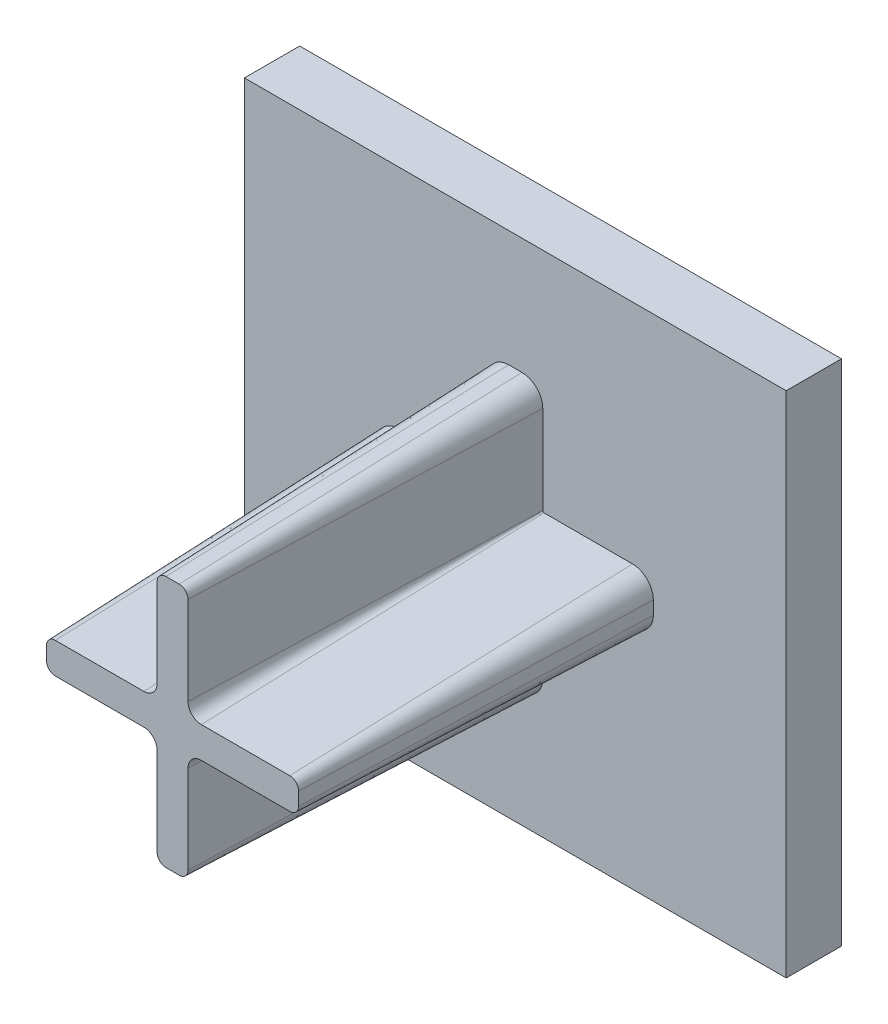
ISO-10303-21;
HEADER;
FILE_DESCRIPTION(('STEP AP214'),'2;1');
FILE_NAME('part.step','',(''),(''),'','','');
FILE_SCHEMA(('AUTOMOTIVE_DESIGN { 1 0 10303 214 1 1 1 1 }'));
ENDSEC;
DATA;
#1=APPLICATION_CONTEXT('core data for automotive mechanical design processes');
#2=APPLICATION_PROTOCOL_DEFINITION('international standard','automotive_design',2000,#1);
#3=PRODUCT_CONTEXT('',#1,'mechanical');
#4=PRODUCT('Part','Part','',(#3));
#5=PRODUCT_RELATED_PRODUCT_CATEGORY('part','',(#4));
#6=PRODUCT_DEFINITION_FORMATION('','',#4);
#7=PRODUCT_DEFINITION_CONTEXT('part definition',#1,'design');
#8=PRODUCT_DEFINITION('design','',#6,#7);
#9=PRODUCT_DEFINITION_SHAPE('','',#8);
#10=(LENGTH_UNIT() NAMED_UNIT(*) SI_UNIT(.MILLI.,.METRE.));
#11=(NAMED_UNIT(*) PLANE_ANGLE_UNIT() SI_UNIT($,.RADIAN.));
#12=(NAMED_UNIT(*) SI_UNIT($,.STERADIAN.) SOLID_ANGLE_UNIT());
#13=UNCERTAINTY_MEASURE_WITH_UNIT(LENGTH_MEASURE(1.E-05),#10,'distance_accuracy_value','');
#14=(GEOMETRIC_REPRESENTATION_CONTEXT(3) GLOBAL_UNCERTAINTY_ASSIGNED_CONTEXT((#13)) GLOBAL_UNIT_ASSIGNED_CONTEXT((#10,
#11,#12)) REPRESENTATION_CONTEXT('',''));
#15=CARTESIAN_POINT('',(0.,0.,0.));
#16=DIRECTION('',(0.,0.,1.));
#17=DIRECTION('',(1.,0.,0.));
#18=AXIS2_PLACEMENT_3D('',#15,#16,#17);
#19=CARTESIAN_POINT('',(0.,2.85003045864904,7.74825502516488));
#20=DIRECTION('',(0.,0.999390827019096,0.0348994967025009));
#21=DIRECTION('',(0.,-0.0348994967025009,0.999390827019096));
#22=AXIS2_PLACEMENT_3D('',#19,#20,#21);
#23=PLANE('',#22);
#24=DIRECTION('',(1.,0.,0.));
#25=VECTOR('',#24,1.);
#26=CARTESIAN_POINT('',(0.,3.1206054863461,0.));
#27=LINE('',#26,#25);
#28=CARTESIAN_POINT('',(0.15,3.12060548634395,4.26323473051715E-11));
#29=VERTEX_POINT('',#28);
#30=CARTESIAN_POINT('',(-0.15,3.12060548634631,4.26323473051715E-11));
#31=VERTEX_POINT('',#30);
#32=EDGE_CURVE('E206',#29,#31,#27,.F.);
#33=ORIENTED_EDGE('',*,*,#32,.T.);
#34=DIRECTION('',(0.,-0.034899496702501,0.999390827019096));
#35=VECTOR('',#34,1.);
#36=CARTESIAN_POINT('',(-0.150000000003201,17428.5845818685,-499000.));
#37=LINE('',#36,#35);
#38=CARTESIAN_POINT('',(-0.15,2.84996952278369,7.75000000003308));
#39=VERTEX_POINT('',#38);
#40=EDGE_CURVE('E329',#39,#31,#37,.F.);
#41=ORIENTED_EDGE('',*,*,#40,.F.);
#42=DIRECTION('',(1.,0.,0.));
#43=VECTOR('',#42,1.);
#44=CARTESIAN_POINT('',(0.,2.84996952278505,7.75));
#45=LINE('',#44,#43);
#46=CARTESIAN_POINT('',(0.15,2.84996952278239,7.75000000003308));
#47=VERTEX_POINT('',#46);
#48=EDGE_CURVE('E341',#39,#47,#45,.T.);
#49=ORIENTED_EDGE('',*,*,#48,.T.);
#50=DIRECTION('',(0.,-0.034899496702501,0.999390827019096));
#51=VECTOR('',#50,1.);
#52=CARTESIAN_POINT('',(0.149999999996799,17428.5845818685,-499000.));
#53=LINE('',#52,#51);
#54=EDGE_CURVE('E210',#29,#47,#53,.T.);
#55=ORIENTED_EDGE('',*,*,#54,.F.);
#56=EDGE_LOOP('',(#33,#41,#49,#55));
#57=FACE_BOUND('',#56,.T.);
#58=ADVANCED_FACE('F17',(#57),#23,.T.);
#59=CARTESIAN_POINT('',(-2.85003045864904,0.,7.74825502516488));
#60=DIRECTION('',(-0.999390827019096,0.,0.0348994967025009));
#61=DIRECTION('',(0.0348994967025009,0.,0.999390827019096));
#62=AXIS2_PLACEMENT_3D('',#59,#60,#61);
#63=PLANE('',#62);
#64=DIRECTION('',(0.,1.,0.));
#65=VECTOR('',#64,1.);
#66=CARTESIAN_POINT('',(-3.1206054863461,0.,0.));
#67=LINE('',#66,#65);
#68=CARTESIAN_POINT('',(-3.12060548634395,0.15,4.26323473051715E-11));
#69=VERTEX_POINT('',#68);
#70=CARTESIAN_POINT('',(-3.12060548634395,-0.15,4.26323473051715E-11));
#71=VERTEX_POINT('',#70);
#72=EDGE_CURVE('E336',#69,#71,#67,.F.);
#73=ORIENTED_EDGE('',*,*,#72,.T.);
#74=DIRECTION('',(0.034899496702501,0.,0.999390827019096));
#75=VECTOR('',#74,1.);
#76=CARTESIAN_POINT('',(-17428.5845818685,-0.150000000002134,-499000.));
#77=LINE('',#76,#75);
#78=CARTESIAN_POINT('',(-2.84996952278328,-0.15,7.75000000003308));
#79=VERTEX_POINT('',#78);
#80=EDGE_CURVE('E320',#79,#71,#77,.F.);
#81=ORIENTED_EDGE('',*,*,#80,.F.);
#82=DIRECTION('',(0.,1.,0.));
#83=VECTOR('',#82,1.);
#84=CARTESIAN_POINT('',(-2.84996952278505,0.,7.75));
#85=LINE('',#84,#83);
#86=CARTESIAN_POINT('',(-2.84996952278328,0.15,7.75000000003308));
#87=VERTEX_POINT('',#86);
#88=EDGE_CURVE('E338',#79,#87,#85,.T.);
#89=ORIENTED_EDGE('',*,*,#88,.T.);
#90=DIRECTION('',(0.034899496702501,0.,0.999390827019096));
#91=VECTOR('',#90,1.);
#92=CARTESIAN_POINT('',(-17428.5845818685,0.149999999997866,-499000.));
#93=LINE('',#92,#91);
#94=EDGE_CURVE('E325',#69,#87,#93,.T.);
#95=ORIENTED_EDGE('',*,*,#94,.F.);
#96=EDGE_LOOP('',(#73,#81,#89,#95));
#97=FACE_BOUND('',#96,.T.);
#98=ADVANCED_FACE('F403',(#97),#63,.T.);
#99=CARTESIAN_POINT('',(0.,-2.85003045864904,7.74825502516488));
#100=DIRECTION('',(0.,-0.999390827019096,0.0348994967025009));
#101=DIRECTION('',(0.,-0.0348994967025009,-0.999390827019096));
#102=AXIS2_PLACEMENT_3D('',#99,#100,#101);
#103=PLANE('',#102);
#104=DIRECTION('',(0.,0.034899496702501,0.999390827019096));
#105=VECTOR('',#104,1.);
#106=CARTESIAN_POINT('',(-0.149999999998933,-17428.5845818685,-499000.));
#107=LINE('',#106,#105);
#108=CARTESIAN_POINT('',(-0.15,-3.12060548634631,4.26323473051715E-11));
#109=VERTEX_POINT('',#108);
#110=CARTESIAN_POINT('',(-0.15,-2.84996952278369,7.75000000003308));
#111=VERTEX_POINT('',#110);
#112=EDGE_CURVE('E316',#109,#111,#107,.T.);
#113=ORIENTED_EDGE('',*,*,#112,.F.);
#114=DIRECTION('',(1.,0.,0.));
#115=VECTOR('',#114,1.);
#116=CARTESIAN_POINT('',(0.,-3.1206054863461,0.));
#117=LINE('',#116,#115);
#118=CARTESIAN_POINT('',(0.15,-3.12060548634395,4.26323473051715E-11));
#119=VERTEX_POINT('',#118);
#120=EDGE_CURVE('E307',#109,#119,#117,.T.);
#121=ORIENTED_EDGE('',*,*,#120,.T.);
#122=DIRECTION('',(0.,0.034899496702501,0.999390827019096));
#123=VECTOR('',#122,1.);
#124=CARTESIAN_POINT('',(0.150000000001067,-17428.5845818685,-499000.));
#125=LINE('',#124,#123);
#126=CARTESIAN_POINT('',(0.15,-2.84996952278239,7.75000000003308));
#127=VERTEX_POINT('',#126);
#128=EDGE_CURVE('E312',#127,#119,#125,.F.);
#129=ORIENTED_EDGE('',*,*,#128,.F.);
#130=DIRECTION('',(1.,0.,0.));
#131=VECTOR('',#130,1.);
#132=CARTESIAN_POINT('',(0.,-2.84996952278505,7.75));
#133=LINE('',#132,#131);
#134=EDGE_CURVE('E334',#127,#111,#133,.F.);
#135=ORIENTED_EDGE('',*,*,#134,.T.);
#136=EDGE_LOOP('',(#113,#121,#129,#135));
#137=FACE_BOUND('',#136,.T.);
#138=ADVANCED_FACE('F408',(#137),#103,.T.);
#139=CARTESIAN_POINT('',(2.85003045864904,0.,7.74825502516488));
#140=DIRECTION('',(0.999390827019096,0.,0.0348994967025009));
#141=DIRECTION('',(0.0348994967025009,0.,-0.999390827019096));
#142=AXIS2_PLACEMENT_3D('',#139,#140,#141);
#143=PLANE('',#142);
#144=DIRECTION('',(-0.034899496702501,0.,0.999390827019096));
#145=VECTOR('',#144,1.);
#146=CARTESIAN_POINT('',(17428.5845818685,-0.15,-499000.));
#147=LINE('',#146,#145);
#148=CARTESIAN_POINT('',(3.12060548634631,-0.15,4.26323473051715E-11));
#149=VERTEX_POINT('',#148);
#150=CARTESIAN_POINT('',(2.84996952278547,-0.15,7.75000000000466));
#151=VERTEX_POINT('',#150);
#152=EDGE_CURVE('E308',#149,#151,#147,.T.);
#153=ORIENTED_EDGE('',*,*,#152,.F.);
#154=DIRECTION('',(0.,1.,0.));
#155=VECTOR('',#154,1.);
#156=CARTESIAN_POINT('',(3.1206054863461,0.,0.));
#157=LINE('',#156,#155);
#158=CARTESIAN_POINT('',(3.12060548634631,0.15,4.26323473051715E-11));
#159=VERTEX_POINT('',#158);
#160=EDGE_CURVE('E211',#149,#159,#157,.T.);
#161=ORIENTED_EDGE('',*,*,#160,.T.);
#162=DIRECTION('',(-0.034899496702501,0.,0.999390827019096));
#163=VECTOR('',#162,1.);
#164=CARTESIAN_POINT('',(17428.5845818685,0.15,-499000.));
#165=LINE('',#164,#163);
#166=CARTESIAN_POINT('',(2.84996952278458,0.15,7.75000000003308));
#167=VERTEX_POINT('',#166);
#168=EDGE_CURVE('E303',#167,#159,#165,.F.);
#169=ORIENTED_EDGE('',*,*,#168,.F.);
#170=DIRECTION('',(0.,1.,0.));
#171=VECTOR('',#170,1.);
#172=CARTESIAN_POINT('',(2.84996952278506,0.,7.75));
#173=LINE('',#172,#171);
#174=EDGE_CURVE('E286',#151,#167,#173,.T.);
#175=ORIENTED_EDGE('',*,*,#174,.F.);
#176=EDGE_LOOP('',(#153,#161,#169,#175));
#177=FACE_BOUND('',#176,.T.);
#178=ADVANCED_FACE('F508',(#177),#143,.T.);
#179=CARTESIAN_POINT('',(0.15,2.65,1.70530256582424E-10));
#180=DIRECTION('',(0.,0.,-1.));
#181=DIRECTION('',(-1.,0.,0.));
#182=AXIS2_PLACEMENT_3D('',#179,#180,#181);
#183=CONICAL_SURFACE('',#182,0.470605486336245,0.0349065850402135);
#184=CARTESIAN_POINT('',(0.15,2.65,0.));
#185=DIRECTION('',(0.,0.,-1.));
#186=DIRECTION('',(-1.,0.,0.));
#187=AXIS2_PLACEMENT_3D('',#184,#185,#186);
#188=CIRCLE('',#187,0.4706054863422);
#189=CARTESIAN_POINT('',(0.620605486346104,2.65,0.));
#190=VERTEX_POINT('',#189);
#191=EDGE_CURVE('E20',#190,#29,#188,.F.);
#192=ORIENTED_EDGE('',*,*,#191,.T.);
#193=ORIENTED_EDGE('',*,*,#54,.T.);
#194=CARTESIAN_POINT('',(0.15,2.65,7.74999999998727));
#195=DIRECTION('',(0.,0.,-1.));
#196=DIRECTION('',(-1.,0.,0.));
#197=AXIS2_PLACEMENT_3D('',#194,#195,#196);
#198=CIRCLE('',#197,0.199969522779063);
#199=CARTESIAN_POINT('',(0.349969522785281,2.65,7.74999999999363));
#200=VERTEX_POINT('',#199);
#201=EDGE_CURVE('E216',#200,#47,#198,.F.);
#202=ORIENTED_EDGE('',*,*,#201,.F.);
#203=DIRECTION('',(0.0348994967025009,0.,-0.999390827019096));
#204=VECTOR('',#203,1.);
#205=CARTESIAN_POINT('',(0.350030458649045,2.65,7.74825502516488));
#206=LINE('',#205,#204);
#207=EDGE_CURVE('E213',#190,#200,#206,.F.);
#208=ORIENTED_EDGE('',*,*,#207,.F.);
#209=EDGE_LOOP('',(#192,#193,#202,#208));
#210=FACE_BOUND('',#209,.T.);
#211=ADVANCED_FACE('F214',(#210),#183,.T.);
#212=CARTESIAN_POINT('',(-0.15,2.65,1.70530256582424E-10));
#213=DIRECTION('',(0.,0.,-1.));
#214=DIRECTION('',(-1.,0.,0.));
#215=AXIS2_PLACEMENT_3D('',#212,#213,#214);
#216=CONICAL_SURFACE('',#215,0.470605486340497,0.0349065850402135);
#217=CARTESIAN_POINT('',(-0.15,2.65,0.));
#218=DIRECTION('',(0.,0.,-1.));
#219=DIRECTION('',(-1.,0.,0.));
#220=AXIS2_PLACEMENT_3D('',#217,#218,#219);
#221=CIRCLE('',#220,0.470605486346452);
#222=CARTESIAN_POINT('',(-0.620605486346104,2.65,0.));
#223=VERTEX_POINT('',#222);
#224=EDGE_CURVE('E332',#31,#223,#221,.F.);
#225=ORIENTED_EDGE('',*,*,#224,.T.);
#226=DIRECTION('',(0.0348994967025009,0.,0.999390827019096));
#227=VECTOR('',#226,1.);
#228=CARTESIAN_POINT('',(-0.350030458649045,2.65,7.74825502516488));
#229=LINE('',#228,#227);
#230=CARTESIAN_POINT('',(-0.349969522785281,2.65,7.74999999999363));
#231=VERTEX_POINT('',#230);
#232=EDGE_CURVE('E277',#231,#223,#229,.F.);
#233=ORIENTED_EDGE('',*,*,#232,.F.);
#234=CARTESIAN_POINT('',(-0.15,2.65,7.74999999998727));
#235=DIRECTION('',(0.,0.,-1.));
#236=DIRECTION('',(-1.,0.,0.));
#237=AXIS2_PLACEMENT_3D('',#234,#235,#236);
#238=CIRCLE('',#237,0.199969522783315);
#239=EDGE_CURVE('E365',#39,#231,#238,.F.);
#240=ORIENTED_EDGE('',*,*,#239,.F.);
#241=ORIENTED_EDGE('',*,*,#40,.T.);
#242=EDGE_LOOP('',(#225,#233,#240,#241));
#243=FACE_BOUND('',#242,.T.);
#244=ADVANCED_FACE('F385',(#243),#216,.T.);
#245=CARTESIAN_POINT('',(-2.65,0.15,1.70530256582424E-10));
#246=DIRECTION('',(0.,0.,-1.));
#247=DIRECTION('',(-1.,0.,0.));
#248=AXIS2_PLACEMENT_3D('',#245,#246,#247);
#249=CONICAL_SURFACE('',#248,0.470605486339218,0.0349065850397557);
#250=CARTESIAN_POINT('',(-2.65,0.15,0.));
#251=DIRECTION('',(0.,0.,-1.));
#252=DIRECTION('',(-1.,0.,0.));
#253=AXIS2_PLACEMENT_3D('',#250,#251,#252);
#254=CIRCLE('',#253,0.470605486345173);
#255=CARTESIAN_POINT('',(-2.65,0.620605486346104,0.));
#256=VERTEX_POINT('',#255);
#257=EDGE_CURVE('E328',#256,#69,#254,.F.);
#258=ORIENTED_EDGE('',*,*,#257,.T.);
#259=ORIENTED_EDGE('',*,*,#94,.T.);
#260=CARTESIAN_POINT('',(-2.65,0.15,7.74999999998727));
#261=DIRECTION('',(0.,0.,-1.));
#262=DIRECTION('',(-1.,0.,0.));
#263=AXIS2_PLACEMENT_3D('',#260,#261,#262);
#264=CIRCLE('',#263,0.199969522785589);
#265=CARTESIAN_POINT('',(-2.65,0.349969522785281,7.74999999999363));
#266=VERTEX_POINT('',#265);
#267=EDGE_CURVE('E360',#266,#87,#264,.F.);
#268=ORIENTED_EDGE('',*,*,#267,.F.);
#269=DIRECTION('',(0.,-0.0348994967025009,0.999390827019096));
#270=VECTOR('',#269,1.);
#271=CARTESIAN_POINT('',(-2.65,0.350030458649045,7.74825502516488));
#272=LINE('',#271,#270);
#273=EDGE_CURVE('E273',#256,#266,#272,.T.);
#274=ORIENTED_EDGE('',*,*,#273,.F.);
#275=EDGE_LOOP('',(#258,#259,#268,#274));
#276=FACE_BOUND('',#275,.T.);
#277=ADVANCED_FACE('F500',(#276),#249,.T.);
#278=CARTESIAN_POINT('',(-0.65,0.65,7.74999999987358));
#279=DIRECTION('',(0.,0.,1.));
#280=DIRECTION('',(1.,0.,0.));
#281=AXIS2_PLACEMENT_3D('',#278,#279,#280);
#282=CONICAL_SURFACE('',#281,0.300030477212681,0.0349065850399577);
#283=CARTESIAN_POINT('',(-0.65,0.65,7.74999999998727));
#284=DIRECTION('',(0.,0.,1.));
#285=DIRECTION('',(1.,0.,0.));
#286=AXIS2_PLACEMENT_3D('',#283,#284,#285);
#287=CIRCLE('',#286,0.300030477216651);
#288=CARTESIAN_POINT('',(-0.349969522785281,0.65,7.74999999999363));
#289=VERTEX_POINT('',#288);
#290=CARTESIAN_POINT('',(-0.65,0.349969522785281,7.74999999999363));
#291=VERTEX_POINT('',#290);
#292=EDGE_CURVE('E363',#289,#291,#287,.F.);
#293=ORIENTED_EDGE('',*,*,#292,.F.);
#294=DIRECTION('',(0.0348994967025009,0.,0.999390827019096));
#295=VECTOR('',#294,1.);
#296=CARTESIAN_POINT('',(-0.350030458649045,0.65,7.74825502516488));
#297=LINE('',#296,#295);
#298=CARTESIAN_POINT('',(-0.620605486346104,0.65,0.));
#299=VERTEX_POINT('',#298);
#300=EDGE_CURVE('E276',#299,#289,#297,.T.);
#301=ORIENTED_EDGE('',*,*,#300,.F.);
#302=CARTESIAN_POINT('',(-0.65,0.65,0.));
#303=DIRECTION('',(0.,0.,1.));
#304=DIRECTION('',(1.,0.,0.));
#305=AXIS2_PLACEMENT_3D('',#302,#303,#304);
#306=CIRCLE('',#305,0.0293945136554989);
#307=CARTESIAN_POINT('',(-0.65,0.620605486346104,0.));
#308=VERTEX_POINT('',#307);
#309=EDGE_CURVE('E324',#308,#299,#306,.T.);
#310=ORIENTED_EDGE('',*,*,#309,.F.);
#311=DIRECTION('',(0.,-0.0348994967025009,0.999390827019096));
#312=VECTOR('',#311,1.);
#313=CARTESIAN_POINT('',(-0.65,0.350030458649045,7.74825502516488));
#314=LINE('',#313,#312);
#315=EDGE_CURVE('E269',#291,#308,#314,.F.);
#316=ORIENTED_EDGE('',*,*,#315,.F.);
#317=EDGE_LOOP('',(#293,#301,#310,#316));
#318=FACE_BOUND('',#317,.T.);
#319=ADVANCED_FACE('F397',(#318),#282,.F.);
#320=CARTESIAN_POINT('',(-2.65,-0.15,1.70530256582424E-10));
#321=DIRECTION('',(0.,0.,-1.));
#322=DIRECTION('',(-1.,0.,0.));
#323=AXIS2_PLACEMENT_3D('',#320,#321,#322);
#324=CONICAL_SURFACE('',#323,0.470605486339218,0.0349065850397557);
#325=CARTESIAN_POINT('',(-2.65,-0.15,0.));
#326=DIRECTION('',(0.,0.,-1.));
#327=DIRECTION('',(-1.,0.,0.));
#328=AXIS2_PLACEMENT_3D('',#325,#326,#327);
#329=CIRCLE('',#328,0.470605486345173);
#330=CARTESIAN_POINT('',(-2.65,-0.620605486346104,0.));
#331=VERTEX_POINT('',#330);
#332=EDGE_CURVE('E323',#71,#331,#329,.F.);
#333=ORIENTED_EDGE('',*,*,#332,.T.);
#334=DIRECTION('',(0.,-0.0348994967025009,-0.999390827019096));
#335=VECTOR('',#334,1.);
#336=CARTESIAN_POINT('',(-2.65,-0.350030458649045,7.74825502516488));
#337=LINE('',#336,#335);
#338=CARTESIAN_POINT('',(-2.65,-0.349969522785281,7.74999999999363));
#339=VERTEX_POINT('',#338);
#340=EDGE_CURVE('E262',#339,#331,#337,.T.);
#341=ORIENTED_EDGE('',*,*,#340,.F.);
#342=CARTESIAN_POINT('',(-2.65,-0.15,7.74999999998727));
#343=DIRECTION('',(0.,0.,-1.));
#344=DIRECTION('',(-1.,0.,0.));
#345=AXIS2_PLACEMENT_3D('',#342,#343,#344);
#346=CIRCLE('',#345,0.199969522785589);
#347=EDGE_CURVE('E358',#79,#339,#346,.F.);
#348=ORIENTED_EDGE('',*,*,#347,.F.);
#349=ORIENTED_EDGE('',*,*,#80,.T.);
#350=EDGE_LOOP('',(#333,#341,#348,#349));
#351=FACE_BOUND('',#350,.T.);
#352=ADVANCED_FACE('F493',(#351),#324,.T.);
#353=CARTESIAN_POINT('',(-0.65,-0.65,7.74999999987358));
#354=DIRECTION('',(0.,0.,1.));
#355=DIRECTION('',(1.,0.,0.));
#356=AXIS2_PLACEMENT_3D('',#353,#354,#355);
#357=CONICAL_SURFACE('',#356,0.300030477212681,0.0349065850399577);
#358=CARTESIAN_POINT('',(-0.65,-0.65,7.74999999998727));
#359=DIRECTION('',(0.,0.,1.));
#360=DIRECTION('',(1.,0.,0.));
#361=AXIS2_PLACEMENT_3D('',#358,#359,#360);
#362=CIRCLE('',#361,0.300030477216651);
#363=CARTESIAN_POINT('',(-0.65,-0.349969522785281,7.74999999999363));
#364=VERTEX_POINT('',#363);
#365=CARTESIAN_POINT('',(-0.349969522785281,-0.65,7.74999999999363));
#366=VERTEX_POINT('',#365);
#367=EDGE_CURVE('E356',#364,#366,#362,.F.);
#368=ORIENTED_EDGE('',*,*,#367,.F.);
#369=DIRECTION('',(0.,-0.0348994967025009,-0.999390827019096));
#370=VECTOR('',#369,1.);
#371=CARTESIAN_POINT('',(-0.65,-0.350030458649045,7.74825502516488));
#372=LINE('',#371,#370);
#373=CARTESIAN_POINT('',(-0.65,-0.620605486346104,0.));
#374=VERTEX_POINT('',#373);
#375=EDGE_CURVE('E265',#374,#364,#372,.F.);
#376=ORIENTED_EDGE('',*,*,#375,.F.);
#377=CARTESIAN_POINT('',(-0.65,-0.65,0.));
#378=DIRECTION('',(0.,0.,1.));
#379=DIRECTION('',(1.,0.,0.));
#380=AXIS2_PLACEMENT_3D('',#377,#378,#379);
#381=CIRCLE('',#380,0.0293945136554989);
#382=CARTESIAN_POINT('',(-0.620605486346104,-0.65,0.));
#383=VERTEX_POINT('',#382);
#384=EDGE_CURVE('E378',#383,#374,#381,.T.);
#385=ORIENTED_EDGE('',*,*,#384,.F.);
#386=DIRECTION('',(0.0348994967025009,0.,0.999390827019096));
#387=VECTOR('',#386,1.);
#388=CARTESIAN_POINT('',(-0.350030458649045,-0.65,7.74825502516488));
#389=LINE('',#388,#387);
#390=EDGE_CURVE('E256',#366,#383,#389,.F.);
#391=ORIENTED_EDGE('',*,*,#390,.F.);
#392=EDGE_LOOP('',(#368,#376,#385,#391));
#393=FACE_BOUND('',#392,.T.);
#394=ADVANCED_FACE('F489',(#393),#357,.F.);
#395=CARTESIAN_POINT('',(-0.15,-2.65,1.70530256582424E-10));
#396=DIRECTION('',(0.,0.,-1.));
#397=DIRECTION('',(-1.,0.,0.));
#398=AXIS2_PLACEMENT_3D('',#395,#396,#397);
#399=CONICAL_SURFACE('',#398,0.470605486340497,0.0349065850402135);
#400=CARTESIAN_POINT('',(-0.15,-2.65,0.));
#401=DIRECTION('',(0.,0.,-1.));
#402=DIRECTION('',(-1.,0.,0.));
#403=AXIS2_PLACEMENT_3D('',#400,#401,#402);
#404=CIRCLE('',#403,0.470605486346452);
#405=CARTESIAN_POINT('',(-0.620605486346104,-2.65,0.));
#406=VERTEX_POINT('',#405);
#407=EDGE_CURVE('E319',#406,#109,#404,.F.);
#408=ORIENTED_EDGE('',*,*,#407,.T.);
#409=ORIENTED_EDGE('',*,*,#112,.T.);
#410=CARTESIAN_POINT('',(-0.15,-2.65,7.74999999998727));
#411=DIRECTION('',(0.,0.,-1.));
#412=DIRECTION('',(-1.,0.,0.));
#413=AXIS2_PLACEMENT_3D('',#410,#411,#412);
#414=CIRCLE('',#413,0.199969522783315);
#415=CARTESIAN_POINT('',(-0.349969522785281,-2.65,7.74999999999363));
#416=VERTEX_POINT('',#415);
#417=EDGE_CURVE('E353',#416,#111,#414,.F.);
#418=ORIENTED_EDGE('',*,*,#417,.F.);
#419=DIRECTION('',(0.0348994967025009,0.,0.999390827019096));
#420=VECTOR('',#419,1.);
#421=CARTESIAN_POINT('',(-0.350030458649045,-2.65,7.74825502516488));
#422=LINE('',#421,#420);
#423=EDGE_CURVE('E255',#406,#416,#422,.T.);
#424=ORIENTED_EDGE('',*,*,#423,.F.);
#425=EDGE_LOOP('',(#408,#409,#418,#424));
#426=FACE_BOUND('',#425,.T.);
#427=ADVANCED_FACE('F485',(#426),#399,.T.);
#428=CARTESIAN_POINT('',(0.15,-2.65,1.70530256582424E-10));
#429=DIRECTION('',(0.,0.,-1.));
#430=DIRECTION('',(-1.,0.,0.));
#431=AXIS2_PLACEMENT_3D('',#428,#429,#430);
#432=CONICAL_SURFACE('',#431,0.470605486336245,0.0349065850402135);
#433=CARTESIAN_POINT('',(0.15,-2.65,0.));
#434=DIRECTION('',(0.,0.,-1.));
#435=DIRECTION('',(-1.,0.,0.));
#436=AXIS2_PLACEMENT_3D('',#433,#434,#435);
#437=CIRCLE('',#436,0.4706054863422);
#438=CARTESIAN_POINT('',(0.620605486346104,-2.65,0.));
#439=VERTEX_POINT('',#438);
#440=EDGE_CURVE('E315',#119,#439,#437,.F.);
#441=ORIENTED_EDGE('',*,*,#440,.T.);
#442=DIRECTION('',(0.0348994967025009,0.,-0.999390827019096));
#443=VECTOR('',#442,1.);
#444=CARTESIAN_POINT('',(0.350030458649045,-2.65,7.74825502516488));
#445=LINE('',#444,#443);
#446=CARTESIAN_POINT('',(0.349969522785281,-2.65,7.74999999999363));
#447=VERTEX_POINT('',#446);
#448=EDGE_CURVE('E248',#447,#439,#445,.T.);
#449=ORIENTED_EDGE('',*,*,#448,.F.);
#450=CARTESIAN_POINT('',(0.15,-2.65,7.74999999998727));
#451=DIRECTION('',(0.,0.,-1.));
#452=DIRECTION('',(-1.,0.,0.));
#453=AXIS2_PLACEMENT_3D('',#450,#451,#452);
#454=CIRCLE('',#453,0.199969522779063);
#455=EDGE_CURVE('E351',#127,#447,#454,.F.);
#456=ORIENTED_EDGE('',*,*,#455,.F.);
#457=ORIENTED_EDGE('',*,*,#128,.T.);
#458=EDGE_LOOP('',(#441,#449,#456,#457));
#459=FACE_BOUND('',#458,.T.);
#460=ADVANCED_FACE('F481',(#459),#432,.T.);
#461=CARTESIAN_POINT('',(0.65,-0.65,7.74999999987358));
#462=DIRECTION('',(0.,0.,1.));
#463=DIRECTION('',(1.,0.,0.));
#464=AXIS2_PLACEMENT_3D('',#461,#462,#463);
#465=CONICAL_SURFACE('',#464,0.300030477213204,0.0349065850399577);
#466=CARTESIAN_POINT('',(0.65,-0.65,7.74999999998727));
#467=DIRECTION('',(0.,0.,1.));
#468=DIRECTION('',(1.,0.,0.));
#469=AXIS2_PLACEMENT_3D('',#466,#467,#468);
#470=CIRCLE('',#469,0.300030477217174);
#471=CARTESIAN_POINT('',(0.349969522785281,-0.65,7.74999999999363));
#472=VERTEX_POINT('',#471);
#473=CARTESIAN_POINT('',(0.65,-0.349969522785281,7.74999999999363));
#474=VERTEX_POINT('',#473);
#475=EDGE_CURVE('E349',#472,#474,#470,.F.);
#476=ORIENTED_EDGE('',*,*,#475,.F.);
#477=DIRECTION('',(0.0348994967025009,0.,-0.999390827019096));
#478=VECTOR('',#477,1.);
#479=CARTESIAN_POINT('',(0.350030458649045,-0.65,7.74825502516488));
#480=LINE('',#479,#478);
#481=CARTESIAN_POINT('',(0.620605486346104,-0.65,0.));
#482=VERTEX_POINT('',#481);
#483=EDGE_CURVE('E252',#482,#472,#480,.F.);
#484=ORIENTED_EDGE('',*,*,#483,.F.);
#485=CARTESIAN_POINT('',(0.65,-0.65,0.));
#486=DIRECTION('',(0.,0.,1.));
#487=DIRECTION('',(1.,0.,0.));
#488=AXIS2_PLACEMENT_3D('',#485,#486,#487);
#489=CIRCLE('',#488,0.0293945136560219);
#490=CARTESIAN_POINT('',(0.65,-0.620605486346104,0.));
#491=VERTEX_POINT('',#490);
#492=EDGE_CURVE('E373',#491,#482,#489,.T.);
#493=ORIENTED_EDGE('',*,*,#492,.F.);
#494=DIRECTION('',(0.,-0.0348994967025009,-0.999390827019096));
#495=VECTOR('',#494,1.);
#496=CARTESIAN_POINT('',(0.65,-0.350030458649045,7.74825502516488));
#497=LINE('',#496,#495);
#498=EDGE_CURVE('E242',#474,#491,#497,.T.);
#499=ORIENTED_EDGE('',*,*,#498,.F.);
#500=EDGE_LOOP('',(#476,#484,#493,#499));
#501=FACE_BOUND('',#500,.T.);
#502=ADVANCED_FACE('F477',(#501),#465,.F.);
#503=CARTESIAN_POINT('',(2.65,-0.15,1.70530256582424E-10));
#504=DIRECTION('',(0.,0.,-1.));
#505=DIRECTION('',(-1.,0.,0.));
#506=AXIS2_PLACEMENT_3D('',#503,#504,#505);
#507=CONICAL_SURFACE('',#506,0.470605486341077,0.0349065850397557);
#508=CARTESIAN_POINT('',(2.65,-0.15,0.));
#509=DIRECTION('',(0.,0.,-1.));
#510=DIRECTION('',(-1.,0.,0.));
#511=AXIS2_PLACEMENT_3D('',#508,#509,#510);
#512=CIRCLE('',#511,0.470605486347032);
#513=CARTESIAN_POINT('',(2.65,-0.620605486346104,0.));
#514=VERTEX_POINT('',#513);
#515=EDGE_CURVE('E311',#514,#149,#512,.F.);
#516=ORIENTED_EDGE('',*,*,#515,.T.);
#517=ORIENTED_EDGE('',*,*,#152,.T.);
#518=CARTESIAN_POINT('',(2.65,-0.15,7.74999999998727));
#519=DIRECTION('',(0.,0.,-1.));
#520=DIRECTION('',(-1.,0.,0.));
#521=AXIS2_PLACEMENT_3D('',#518,#519,#520);
#522=CIRCLE('',#521,0.199969522787448);
#523=CARTESIAN_POINT('',(2.65,-0.349969522785281,7.74999999999363));
#524=VERTEX_POINT('',#523);
#525=EDGE_CURVE('E289',#524,#151,#522,.F.);
#526=ORIENTED_EDGE('',*,*,#525,.F.);
#527=DIRECTION('',(0.,-0.0348994967025009,-0.999390827019096));
#528=VECTOR('',#527,1.);
#529=CARTESIAN_POINT('',(2.65,-0.350030458649045,7.74825502516488));
#530=LINE('',#529,#528);
#531=EDGE_CURVE('E241',#514,#524,#530,.F.);
#532=ORIENTED_EDGE('',*,*,#531,.F.);
#533=EDGE_LOOP('',(#516,#517,#526,#532));
#534=FACE_BOUND('',#533,.T.);
#535=ADVANCED_FACE('F473',(#534),#507,.T.);
#536=CARTESIAN_POINT('',(0.65,0.65,7.74999999987358));
#537=DIRECTION('',(0.,0.,1.));
#538=DIRECTION('',(1.,0.,0.));
#539=AXIS2_PLACEMENT_3D('',#536,#537,#538);
#540=CONICAL_SURFACE('',#539,0.300030477213204,0.0349065850399577);
#541=CARTESIAN_POINT('',(0.65,0.65,7.74999999998727));
#542=DIRECTION('',(0.,0.,1.));
#543=DIRECTION('',(1.,0.,0.));
#544=AXIS2_PLACEMENT_3D('',#541,#542,#543);
#545=CIRCLE('',#544,0.300030477217174);
#546=CARTESIAN_POINT('',(0.65,0.349969522785281,7.74999999999363));
#547=VERTEX_POINT('',#546);
#548=CARTESIAN_POINT('',(0.349969522785281,0.65,7.74999999999363));
#549=VERTEX_POINT('',#548);
#550=EDGE_CURVE('E368',#547,#549,#545,.F.);
#551=ORIENTED_EDGE('',*,*,#550,.F.);
#552=DIRECTION('',(0.,-0.0348994967025009,0.999390827019096));
#553=VECTOR('',#552,1.);
#554=CARTESIAN_POINT('',(0.65,0.350030458649045,7.74825502516488));
#555=LINE('',#554,#553);
#556=CARTESIAN_POINT('',(0.65,0.620605486346104,0.));
#557=VERTEX_POINT('',#556);
#558=EDGE_CURVE('E238',#557,#547,#555,.T.);
#559=ORIENTED_EDGE('',*,*,#558,.F.);
#560=CARTESIAN_POINT('',(0.65,0.65,0.));
#561=DIRECTION('',(0.,0.,1.));
#562=DIRECTION('',(1.,0.,0.));
#563=AXIS2_PLACEMENT_3D('',#560,#561,#562);
#564=CIRCLE('',#563,0.0293945136560219);
#565=CARTESIAN_POINT('',(0.620605486346104,0.65,0.));
#566=VERTEX_POINT('',#565);
#567=EDGE_CURVE('E310',#566,#557,#564,.T.);
#568=ORIENTED_EDGE('',*,*,#567,.F.);
#569=DIRECTION('',(0.0348994967025009,0.,-0.999390827019096));
#570=VECTOR('',#569,1.);
#571=CARTESIAN_POINT('',(0.350030458649045,0.65,7.74825502516488));
#572=LINE('',#571,#570);
#573=EDGE_CURVE('E226',#549,#566,#572,.T.);
#574=ORIENTED_EDGE('',*,*,#573,.F.);
#575=EDGE_LOOP('',(#551,#559,#568,#574));
#576=FACE_BOUND('',#575,.T.);
#577=ADVANCED_FACE('F470',(#576),#540,.F.);
#578=CARTESIAN_POINT('',(0.,0.,7.75));
#579=DIRECTION('',(0.,0.,1.));
#580=DIRECTION('',(1.,0.,0.));
#581=AXIS2_PLACEMENT_3D('',#578,#579,#580);
#582=PLANE('',#581);
#583=ORIENTED_EDGE('',*,*,#174,.T.);
#584=CARTESIAN_POINT('',(2.65,0.15,7.74999999998727));
#585=DIRECTION('',(0.,0.,-1.));
#586=DIRECTION('',(-1.,0.,0.));
#587=AXIS2_PLACEMENT_3D('',#584,#585,#586);
#588=CIRCLE('',#587,0.199969522787448);
#589=CARTESIAN_POINT('',(2.65,0.349969522785281,7.74999999999363));
#590=VERTEX_POINT('',#589);
#591=EDGE_CURVE('E288',#590,#167,#588,.T.);
#592=ORIENTED_EDGE('',*,*,#591,.F.);
#593=DIRECTION('',(1.,0.,0.));
#594=VECTOR('',#593,1.);
#595=CARTESIAN_POINT('',(0.,0.349969522785059,7.75));
#596=LINE('',#595,#594);
#597=EDGE_CURVE('E234',#547,#590,#596,.T.);
#598=ORIENTED_EDGE('',*,*,#597,.F.);
#599=ORIENTED_EDGE('',*,*,#550,.T.);
#600=DIRECTION('',(0.,1.,0.));
#601=VECTOR('',#600,1.);
#602=CARTESIAN_POINT('',(0.349969522785059,0.,7.75));
#603=LINE('',#602,#601);
#604=EDGE_CURVE('E220',#200,#549,#603,.F.);
#605=ORIENTED_EDGE('',*,*,#604,.F.);
#606=ORIENTED_EDGE('',*,*,#201,.T.);
#607=ORIENTED_EDGE('',*,*,#48,.F.);
#608=ORIENTED_EDGE('',*,*,#239,.T.);
#609=DIRECTION('',(0.,1.,0.));
#610=VECTOR('',#609,1.);
#611=CARTESIAN_POINT('',(-0.349969522785059,0.,7.75));
#612=LINE('',#611,#610);
#613=EDGE_CURVE('E280',#289,#231,#612,.T.);
#614=ORIENTED_EDGE('',*,*,#613,.F.);
#615=ORIENTED_EDGE('',*,*,#292,.T.);
#616=DIRECTION('',(1.,0.,0.));
#617=VECTOR('',#616,1.);
#618=CARTESIAN_POINT('',(0.,0.349969522785059,7.75));
#619=LINE('',#618,#617);
#620=EDGE_CURVE('E272',#266,#291,#619,.T.);
#621=ORIENTED_EDGE('',*,*,#620,.F.);
#622=ORIENTED_EDGE('',*,*,#267,.T.);
#623=ORIENTED_EDGE('',*,*,#88,.F.);
#624=ORIENTED_EDGE('',*,*,#347,.T.);
#625=DIRECTION('',(1.,0.,0.));
#626=VECTOR('',#625,1.);
#627=CARTESIAN_POINT('',(0.,-0.349969522785059,7.75));
#628=LINE('',#627,#626);
#629=EDGE_CURVE('E266',#364,#339,#628,.F.);
#630=ORIENTED_EDGE('',*,*,#629,.F.);
#631=ORIENTED_EDGE('',*,*,#367,.T.);
#632=DIRECTION('',(0.,1.,0.));
#633=VECTOR('',#632,1.);
#634=CARTESIAN_POINT('',(-0.349969522785059,0.,7.75));
#635=LINE('',#634,#633);
#636=EDGE_CURVE('E259',#416,#366,#635,.T.);
#637=ORIENTED_EDGE('',*,*,#636,.F.);
#638=ORIENTED_EDGE('',*,*,#417,.T.);
#639=ORIENTED_EDGE('',*,*,#134,.F.);
#640=ORIENTED_EDGE('',*,*,#455,.T.);
#641=DIRECTION('',(0.,1.,0.));
#642=VECTOR('',#641,1.);
#643=CARTESIAN_POINT('',(0.349969522785059,0.,7.75));
#644=LINE('',#643,#642);
#645=EDGE_CURVE('E251',#472,#447,#644,.F.);
#646=ORIENTED_EDGE('',*,*,#645,.F.);
#647=ORIENTED_EDGE('',*,*,#475,.T.);
#648=DIRECTION('',(1.,0.,0.));
#649=VECTOR('',#648,1.);
#650=CARTESIAN_POINT('',(0.,-0.349969522785059,7.75));
#651=LINE('',#650,#649);
#652=EDGE_CURVE('E245',#524,#474,#651,.F.);
#653=ORIENTED_EDGE('',*,*,#652,.F.);
#654=ORIENTED_EDGE('',*,*,#525,.T.);
#655=EDGE_LOOP('',(#583,#592,#598,#599,#605,#606,#607,#608,#614,#615,#621,#622,#623,#624,#630,
#631,#637,#638,#639,#640,#646,#647,#653,#654));
#656=FACE_BOUND('',#655,.T.);
#657=ADVANCED_FACE('F400',(#656),#582,.T.);
#658=CARTESIAN_POINT('',(2.65,0.15,1.70530256582424E-10));
#659=DIRECTION('',(0.,0.,-1.));
#660=DIRECTION('',(-1.,0.,0.));
#661=AXIS2_PLACEMENT_3D('',#658,#659,#660);
#662=CONICAL_SURFACE('',#661,0.470605486341077,0.0349065850397557);
#663=CARTESIAN_POINT('',(2.65,0.15,0.));
#664=DIRECTION('',(0.,0.,-1.));
#665=DIRECTION('',(-1.,0.,0.));
#666=AXIS2_PLACEMENT_3D('',#663,#664,#665);
#667=CIRCLE('',#666,0.470605486347032);
#668=CARTESIAN_POINT('',(2.65,0.620605486346104,0.));
#669=VERTEX_POINT('',#668);
#670=EDGE_CURVE('E221',#159,#669,#667,.F.);
#671=ORIENTED_EDGE('',*,*,#670,.T.);
#672=DIRECTION('',(0.,-0.0348994967025009,0.999390827019096));
#673=VECTOR('',#672,1.);
#674=CARTESIAN_POINT('',(2.65,0.350030458649045,7.74825502516488));
#675=LINE('',#674,#673);
#676=EDGE_CURVE('E228',#590,#669,#675,.F.);
#677=ORIENTED_EDGE('',*,*,#676,.F.);
#678=ORIENTED_EDGE('',*,*,#591,.T.);
#679=ORIENTED_EDGE('',*,*,#168,.T.);
#680=EDGE_LOOP('',(#671,#677,#678,#679));
#681=FACE_BOUND('',#680,.T.);
#682=ADVANCED_FACE('F464',(#681),#662,.T.);
#683=CARTESIAN_POINT('',(0.350030458649045,0.,7.74825502516488));
#684=DIRECTION('',(0.999390827019096,0.,0.0348994967025009));
#685=DIRECTION('',(0.0348994967025009,0.,-0.999390827019096));
#686=AXIS2_PLACEMENT_3D('',#683,#684,#685);
#687=PLANE('',#686);
#688=ORIENTED_EDGE('',*,*,#573,.T.);
#689=DIRECTION('',(0.,1.,0.));
#690=VECTOR('',#689,1.);
#691=CARTESIAN_POINT('',(0.620605486346104,0.,0.));
#692=LINE('',#691,#690);
#693=EDGE_CURVE('E204',#566,#190,#692,.T.);
#694=ORIENTED_EDGE('',*,*,#693,.T.);
#695=ORIENTED_EDGE('',*,*,#207,.T.);
#696=ORIENTED_EDGE('',*,*,#604,.T.);
#697=EDGE_LOOP('',(#688,#694,#695,#696));
#698=FACE_BOUND('',#697,.T.);
#699=ADVANCED_FACE('F224',(#698),#687,.T.);
#700=CARTESIAN_POINT('',(-0.350030458649045,0.,7.74825502516488));
#701=DIRECTION('',(-0.999390827019096,0.,0.0348994967025009));
#702=DIRECTION('',(0.0348994967025009,0.,0.999390827019096));
#703=AXIS2_PLACEMENT_3D('',#700,#701,#702);
#704=PLANE('',#703);
#705=DIRECTION('',(0.,1.,0.));
#706=VECTOR('',#705,1.);
#707=CARTESIAN_POINT('',(-0.620605486346104,0.,0.));
#708=LINE('',#707,#706);
#709=EDGE_CURVE('E227',#223,#299,#708,.F.);
#710=ORIENTED_EDGE('',*,*,#709,.T.);
#711=ORIENTED_EDGE('',*,*,#300,.T.);
#712=ORIENTED_EDGE('',*,*,#613,.T.);
#713=ORIENTED_EDGE('',*,*,#232,.T.);
#714=EDGE_LOOP('',(#710,#711,#712,#713));
#715=FACE_BOUND('',#714,.T.);
#716=ADVANCED_FACE('F390',(#715),#704,.T.);
#717=CARTESIAN_POINT('',(0.,0.350030458649045,7.74825502516488));
#718=DIRECTION('',(0.,0.999390827019096,0.0348994967025009));
#719=DIRECTION('',(0.,-0.0348994967025009,0.999390827019096));
#720=AXIS2_PLACEMENT_3D('',#717,#718,#719);
#721=PLANE('',#720);
#722=ORIENTED_EDGE('',*,*,#315,.T.);
#723=DIRECTION('',(-1.,0.,0.));
#724=VECTOR('',#723,1.);
#725=CARTESIAN_POINT('',(0.,0.620605486346104,0.));
#726=LINE('',#725,#724);
#727=EDGE_CURVE('E231',#308,#256,#726,.T.);
#728=ORIENTED_EDGE('',*,*,#727,.T.);
#729=ORIENTED_EDGE('',*,*,#273,.T.);
#730=ORIENTED_EDGE('',*,*,#620,.T.);
#731=EDGE_LOOP('',(#722,#728,#729,#730));
#732=FACE_BOUND('',#731,.T.);
#733=ADVANCED_FACE('F455',(#732),#721,.T.);
#734=CARTESIAN_POINT('',(0.,-0.350030458649045,7.74825502516488));
#735=DIRECTION('',(0.,-0.999390827019096,0.0348994967025009));
#736=DIRECTION('',(0.,-0.0348994967025009,-0.999390827019096));
#737=AXIS2_PLACEMENT_3D('',#734,#735,#736);
#738=PLANE('',#737);
#739=DIRECTION('',(-1.,0.,0.));
#740=VECTOR('',#739,1.);
#741=CARTESIAN_POINT('',(0.,-0.620605486346104,0.));
#742=LINE('',#741,#740);
#743=EDGE_CURVE('E532',#331,#374,#742,.F.);
#744=ORIENTED_EDGE('',*,*,#743,.T.);
#745=ORIENTED_EDGE('',*,*,#375,.T.);
#746=ORIENTED_EDGE('',*,*,#629,.T.);
#747=ORIENTED_EDGE('',*,*,#340,.T.);
#748=EDGE_LOOP('',(#744,#745,#746,#747));
#749=FACE_BOUND('',#748,.T.);
#750=ADVANCED_FACE('F451',(#749),#738,.T.);
#751=CARTESIAN_POINT('',(-0.350030458649045,0.,7.74825502516488));
#752=DIRECTION('',(-0.999390827019096,0.,0.0348994967025009));
#753=DIRECTION('',(0.0348994967025009,0.,0.999390827019096));
#754=AXIS2_PLACEMENT_3D('',#751,#752,#753);
#755=PLANE('',#754);
#756=DIRECTION('',(0.,1.,0.));
#757=VECTOR('',#756,1.);
#758=CARTESIAN_POINT('',(-0.620605486346104,0.,0.));
#759=LINE('',#758,#757);
#760=EDGE_CURVE('E522',#383,#406,#759,.F.);
#761=ORIENTED_EDGE('',*,*,#760,.T.);
#762=ORIENTED_EDGE('',*,*,#423,.T.);
#763=ORIENTED_EDGE('',*,*,#636,.T.);
#764=ORIENTED_EDGE('',*,*,#390,.T.);
#765=EDGE_LOOP('',(#761,#762,#763,#764));
#766=FACE_BOUND('',#765,.T.);
#767=ADVANCED_FACE('F447',(#766),#755,.T.);
#768=CARTESIAN_POINT('',(0.350030458649045,0.,7.74825502516488));
#769=DIRECTION('',(0.999390827019096,0.,0.0348994967025009));
#770=DIRECTION('',(0.0348994967025009,0.,-0.999390827019096));
#771=AXIS2_PLACEMENT_3D('',#768,#769,#770);
#772=PLANE('',#771);
#773=ORIENTED_EDGE('',*,*,#448,.T.);
#774=DIRECTION('',(0.,1.,0.));
#775=VECTOR('',#774,1.);
#776=CARTESIAN_POINT('',(0.620605486346104,0.,0.));
#777=LINE('',#776,#775);
#778=EDGE_CURVE('E525',#439,#482,#777,.T.);
#779=ORIENTED_EDGE('',*,*,#778,.T.);
#780=ORIENTED_EDGE('',*,*,#483,.T.);
#781=ORIENTED_EDGE('',*,*,#645,.T.);
#782=EDGE_LOOP('',(#773,#779,#780,#781));
#783=FACE_BOUND('',#782,.T.);
#784=ADVANCED_FACE('F443',(#783),#772,.T.);
#785=CARTESIAN_POINT('',(0.,-0.350030458649045,7.74825502516488));
#786=DIRECTION('',(0.,-0.999390827019096,0.0348994967025009));
#787=DIRECTION('',(0.,-0.0348994967025009,-0.999390827019096));
#788=AXIS2_PLACEMENT_3D('',#785,#786,#787);
#789=PLANE('',#788);
#790=DIRECTION('',(-1.,0.,0.));
#791=VECTOR('',#790,1.);
#792=CARTESIAN_POINT('',(0.,-0.620605486346104,0.));
#793=LINE('',#792,#791);
#794=EDGE_CURVE('E534',#491,#514,#793,.F.);
#795=ORIENTED_EDGE('',*,*,#794,.T.);
#796=ORIENTED_EDGE('',*,*,#531,.T.);
#797=ORIENTED_EDGE('',*,*,#652,.T.);
#798=ORIENTED_EDGE('',*,*,#498,.T.);
#799=EDGE_LOOP('',(#795,#796,#797,#798));
#800=FACE_BOUND('',#799,.T.);
#801=ADVANCED_FACE('F439',(#800),#789,.T.);
#802=CARTESIAN_POINT('',(0.,0.350030458649045,7.74825502516488));
#803=DIRECTION('',(0.,0.999390827019096,0.0348994967025009));
#804=DIRECTION('',(0.,-0.0348994967025009,0.999390827019096));
#805=AXIS2_PLACEMENT_3D('',#802,#803,#804);
#806=PLANE('',#805);
#807=ORIENTED_EDGE('',*,*,#676,.T.);
#808=DIRECTION('',(-1.,0.,0.));
#809=VECTOR('',#808,1.);
#810=CARTESIAN_POINT('',(0.,0.620605486346104,0.));
#811=LINE('',#810,#809);
#812=EDGE_CURVE('E549',#669,#557,#811,.T.);
#813=ORIENTED_EDGE('',*,*,#812,.T.);
#814=ORIENTED_EDGE('',*,*,#558,.T.);
#815=ORIENTED_EDGE('',*,*,#597,.T.);
#816=EDGE_LOOP('',(#807,#813,#814,#815));
#817=FACE_BOUND('',#816,.T.);
#818=ADVANCED_FACE('F435',(#817),#806,.T.);
#819=CARTESIAN_POINT('',(0.,0.,0.));
#820=DIRECTION('',(0.,0.,-1.));
#821=DIRECTION('',(-1.,0.,0.));
#822=AXIS2_PLACEMENT_3D('',#819,#820,#821);
#823=PLANE('',#822);
#824=DIRECTION('',(0.,1.,0.));
#825=VECTOR('',#824,1.);
#826=CARTESIAN_POINT('',(-6.125,0.,0.));
#827=LINE('',#826,#825);
#828=CARTESIAN_POINT('',(-6.125,5.75,0.));
#829=VERTEX_POINT('',#828);
#830=CARTESIAN_POINT('',(-6.125,-5.75,0.));
#831=VERTEX_POINT('',#830);
#832=EDGE_CURVE('E568',#829,#831,#827,.F.);
#833=ORIENTED_EDGE('',*,*,#832,.T.);
#834=DIRECTION('',(1.,0.,0.));
#835=VECTOR('',#834,1.);
#836=CARTESIAN_POINT('',(0.,-5.75,0.));
#837=LINE('',#836,#835);
#838=CARTESIAN_POINT('',(6.125,-5.75,0.));
#839=VERTEX_POINT('',#838);
#840=EDGE_CURVE('E561',#831,#839,#837,.T.);
#841=ORIENTED_EDGE('',*,*,#840,.T.);
#842=DIRECTION('',(0.,-1.,0.));
#843=VECTOR('',#842,1.);
#844=CARTESIAN_POINT('',(6.125,0.,0.));
#845=LINE('',#844,#843);
#846=CARTESIAN_POINT('',(6.125,5.75,0.));
#847=VERTEX_POINT('',#846);
#848=EDGE_CURVE('E556',#839,#847,#845,.F.);
#849=ORIENTED_EDGE('',*,*,#848,.T.);
#850=DIRECTION('',(1.,0.,0.));
#851=VECTOR('',#850,1.);
#852=CARTESIAN_POINT('',(0.,5.75,0.));
#853=LINE('',#852,#851);
#854=EDGE_CURVE('E552',#847,#829,#853,.F.);
#855=ORIENTED_EDGE('',*,*,#854,.T.);
#856=EDGE_LOOP('',(#833,#841,#849,#855));
#857=FACE_BOUND('',#856,.T.);
#858=ORIENTED_EDGE('',*,*,#812,.F.);
#859=ORIENTED_EDGE('',*,*,#670,.F.);
#860=ORIENTED_EDGE('',*,*,#160,.F.);
#861=ORIENTED_EDGE('',*,*,#515,.F.);
#862=ORIENTED_EDGE('',*,*,#794,.F.);
#863=ORIENTED_EDGE('',*,*,#492,.T.);
#864=ORIENTED_EDGE('',*,*,#778,.F.);
#865=ORIENTED_EDGE('',*,*,#440,.F.);
#866=ORIENTED_EDGE('',*,*,#120,.F.);
#867=ORIENTED_EDGE('',*,*,#407,.F.);
#868=ORIENTED_EDGE('',*,*,#760,.F.);
#869=ORIENTED_EDGE('',*,*,#384,.T.);
#870=ORIENTED_EDGE('',*,*,#743,.F.);
#871=ORIENTED_EDGE('',*,*,#332,.F.);
#872=ORIENTED_EDGE('',*,*,#72,.F.);
#873=ORIENTED_EDGE('',*,*,#257,.F.);
#874=ORIENTED_EDGE('',*,*,#727,.F.);
#875=ORIENTED_EDGE('',*,*,#309,.T.);
#876=ORIENTED_EDGE('',*,*,#709,.F.);
#877=ORIENTED_EDGE('',*,*,#224,.F.);
#878=ORIENTED_EDGE('',*,*,#32,.F.);
#879=ORIENTED_EDGE('',*,*,#191,.F.);
#880=ORIENTED_EDGE('',*,*,#693,.F.);
#881=ORIENTED_EDGE('',*,*,#567,.T.);
#882=EDGE_LOOP('',(#858,#859,#860,#861,#862,#863,#864,#865,#866,#867,#868,#869,#870,#871,#872,
#873,#874,#875,#876,#877,#878,#879,#880,#881));
#883=FACE_BOUND('',#882,.T.);
#884=ADVANCED_FACE('F202',(#857,#883),#823,.F.);
#885=CARTESIAN_POINT('',(0.,5.75,-1.25));
#886=DIRECTION('',(0.,-1.,0.));
#887=DIRECTION('',(0.,0.,-1.));
#888=AXIS2_PLACEMENT_3D('',#885,#886,#887);
#889=PLANE('',#888);
#890=DIRECTION('',(0.,0.,1.));
#891=VECTOR('',#890,1.);
#892=CARTESIAN_POINT('',(6.125,5.75,-1.25));
#893=LINE('',#892,#891);
#894=CARTESIAN_POINT('',(6.125,5.75,-1.25));
#895=VERTEX_POINT('',#894);
#896=EDGE_CURVE('E554',#847,#895,#893,.F.);
#897=ORIENTED_EDGE('',*,*,#896,.T.);
#898=DIRECTION('',(-1.,0.,0.));
#899=VECTOR('',#898,1.);
#900=CARTESIAN_POINT('',(0.,5.75,-1.25));
#901=LINE('',#900,#899);
#902=CARTESIAN_POINT('',(-6.125,5.75,-1.25));
#903=VERTEX_POINT('',#902);
#904=EDGE_CURVE('E571',#903,#895,#901,.F.);
#905=ORIENTED_EDGE('',*,*,#904,.F.);
#906=DIRECTION('',(0.,0.,1.));
#907=VECTOR('',#906,1.);
#908=CARTESIAN_POINT('',(-6.125,5.75,-1.25));
#909=LINE('',#908,#907);
#910=EDGE_CURVE('E565',#903,#829,#909,.T.);
#911=ORIENTED_EDGE('',*,*,#910,.T.);
#912=ORIENTED_EDGE('',*,*,#854,.F.);
#913=EDGE_LOOP('',(#897,#905,#911,#912));
#914=FACE_BOUND('',#913,.T.);
#915=ADVANCED_FACE('F428',(#914),#889,.F.);
#916=CARTESIAN_POINT('',(6.125,0.,-1.25));
#917=DIRECTION('',(-1.,0.,0.));
#918=DIRECTION('',(0.,-1.,0.));
#919=AXIS2_PLACEMENT_3D('',#916,#917,#918);
#920=PLANE('',#919);
#921=DIRECTION('',(0.,0.,1.));
#922=VECTOR('',#921,1.);
#923=CARTESIAN_POINT('',(6.125,-5.75,-1.25));
#924=LINE('',#923,#922);
#925=CARTESIAN_POINT('',(6.125,-5.75,-1.25));
#926=VERTEX_POINT('',#925);
#927=EDGE_CURVE('E559',#839,#926,#924,.F.);
#928=ORIENTED_EDGE('',*,*,#927,.T.);
#929=DIRECTION('',(0.,1.,0.));
#930=VECTOR('',#929,1.);
#931=CARTESIAN_POINT('',(6.125,0.,-1.25));
#932=LINE('',#931,#930);
#933=EDGE_CURVE('E574',#895,#926,#932,.F.);
#934=ORIENTED_EDGE('',*,*,#933,.F.);
#935=ORIENTED_EDGE('',*,*,#896,.F.);
#936=ORIENTED_EDGE('',*,*,#848,.F.);
#937=EDGE_LOOP('',(#928,#934,#935,#936));
#938=FACE_BOUND('',#937,.T.);
#939=ADVANCED_FACE('F425',(#938),#920,.F.);
#940=CARTESIAN_POINT('',(0.,-5.75,-1.25));
#941=DIRECTION('',(0.,1.,0.));
#942=DIRECTION('',(0.,0.,1.));
#943=AXIS2_PLACEMENT_3D('',#940,#941,#942);
#944=PLANE('',#943);
#945=DIRECTION('',(0.,0.,1.));
#946=VECTOR('',#945,1.);
#947=CARTESIAN_POINT('',(-6.125,-5.75,-1.25));
#948=LINE('',#947,#946);
#949=CARTESIAN_POINT('',(-6.125,-5.75,-1.25));
#950=VERTEX_POINT('',#949);
#951=EDGE_CURVE('E35',#831,#950,#948,.F.);
#952=ORIENTED_EDGE('',*,*,#951,.T.);
#953=DIRECTION('',(-1.,0.,0.));
#954=VECTOR('',#953,1.);
#955=CARTESIAN_POINT('',(0.,-5.75,-1.25));
#956=LINE('',#955,#954);
#957=EDGE_CURVE('E26',#926,#950,#956,.T.);
#958=ORIENTED_EDGE('',*,*,#957,.F.);
#959=ORIENTED_EDGE('',*,*,#927,.F.);
#960=ORIENTED_EDGE('',*,*,#840,.F.);
#961=EDGE_LOOP('',(#952,#958,#959,#960));
#962=FACE_BOUND('',#961,.T.);
#963=ADVANCED_FACE('F418',(#962),#944,.F.);
#964=CARTESIAN_POINT('',(-6.125,0.,-1.25));
#965=DIRECTION('',(1.,0.,0.));
#966=DIRECTION('',(0.,1.,0.));
#967=AXIS2_PLACEMENT_3D('',#964,#965,#966);
#968=PLANE('',#967);
#969=ORIENTED_EDGE('',*,*,#910,.F.);
#970=DIRECTION('',(0.,1.,0.));
#971=VECTOR('',#970,1.);
#972=CARTESIAN_POINT('',(-6.125,0.,-1.25));
#973=LINE('',#972,#971);
#974=EDGE_CURVE('E11',#950,#903,#973,.T.);
#975=ORIENTED_EDGE('',*,*,#974,.F.);
#976=ORIENTED_EDGE('',*,*,#951,.F.);
#977=ORIENTED_EDGE('',*,*,#832,.F.);
#978=EDGE_LOOP('',(#969,#975,#976,#977));
#979=FACE_BOUND('',#978,.T.);
#980=ADVANCED_FACE('F412',(#979),#968,.F.);
#981=CARTESIAN_POINT('',(0.,0.,-1.25));
#982=DIRECTION('',(0.,0.,-1.));
#983=DIRECTION('',(-1.,0.,0.));
#984=AXIS2_PLACEMENT_3D('',#981,#982,#983);
#985=PLANE('',#984);
#986=ORIENTED_EDGE('',*,*,#957,.T.);
#987=ORIENTED_EDGE('',*,*,#974,.T.);
#988=ORIENTED_EDGE('',*,*,#904,.T.);
#989=ORIENTED_EDGE('',*,*,#933,.T.);
#990=EDGE_LOOP('',(#986,#987,#988,#989));
#991=FACE_BOUND('',#990,.T.);
#992=ADVANCED_FACE('F410',(#991),#985,.T.);
#993=CLOSED_SHELL('',(#58,#98,#138,#178,#211,#244,#277,#319,#352,#394,#427,#460,#502,#535,#577,
#657,#682,#699,#716,#733,#750,#767,#784,#801,#818,#884,#915,#939,#963,#980,#992));
#994=MANIFOLD_SOLID_BREP('B1',#993);
#995=ADVANCED_BREP_SHAPE_REPRESENTATION('',(#18,#994),#14);
#996=SHAPE_DEFINITION_REPRESENTATION(#9,#995);
ENDSEC;
END-ISO-10303-21;
